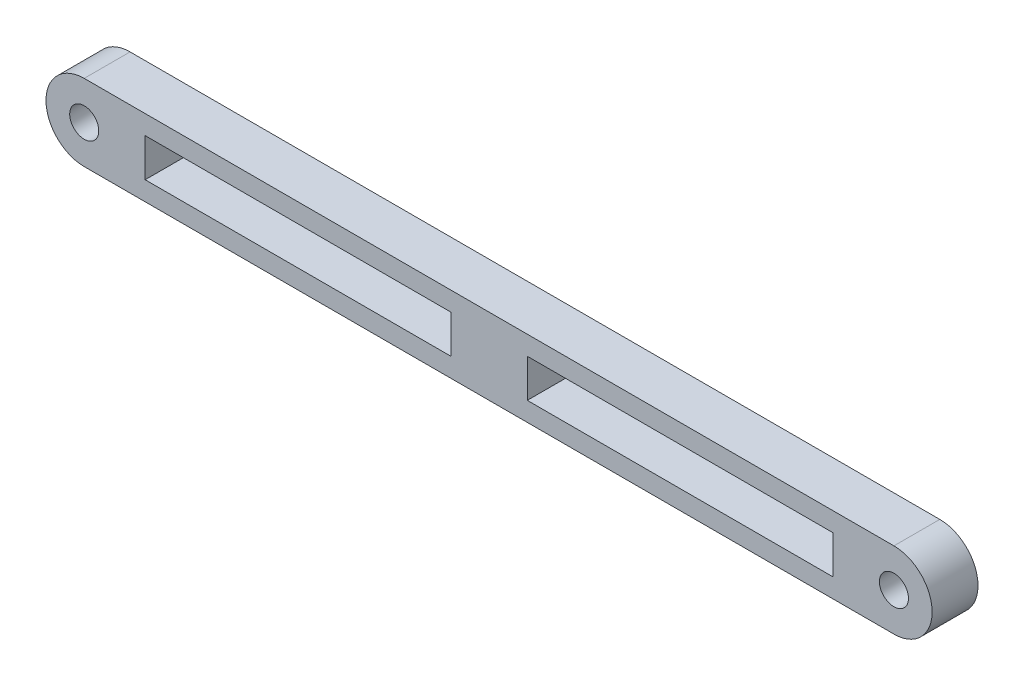
ISO-10303-21;
HEADER;
FILE_DESCRIPTION(('STEP AP214'),'2;1');
FILE_NAME('part.step','',(''),(''),'','','');
FILE_SCHEMA(('AUTOMOTIVE_DESIGN { 1 0 10303 214 1 1 1 1 }'));
ENDSEC;
DATA;
#1=APPLICATION_CONTEXT('core data for automotive mechanical design processes');
#2=APPLICATION_PROTOCOL_DEFINITION('international standard','automotive_design',2000,#1);
#3=PRODUCT_CONTEXT('',#1,'mechanical');
#4=PRODUCT('Part','Part','',(#3));
#5=PRODUCT_RELATED_PRODUCT_CATEGORY('part','',(#4));
#6=PRODUCT_DEFINITION_FORMATION('','',#4);
#7=PRODUCT_DEFINITION_CONTEXT('part definition',#1,'design');
#8=PRODUCT_DEFINITION('design','',#6,#7);
#9=PRODUCT_DEFINITION_SHAPE('','',#8);
#10=(LENGTH_UNIT() NAMED_UNIT(*) SI_UNIT(.MILLI.,.METRE.));
#11=(NAMED_UNIT(*) PLANE_ANGLE_UNIT() SI_UNIT($,.RADIAN.));
#12=(NAMED_UNIT(*) SI_UNIT($,.STERADIAN.) SOLID_ANGLE_UNIT());
#13=UNCERTAINTY_MEASURE_WITH_UNIT(LENGTH_MEASURE(1.E-05),#10,'distance_accuracy_value','');
#14=(GEOMETRIC_REPRESENTATION_CONTEXT(3) GLOBAL_UNCERTAINTY_ASSIGNED_CONTEXT((#13)) GLOBAL_UNIT_ASSIGNED_CONTEXT((#10,
#11,#12)) REPRESENTATION_CONTEXT('',''));
#15=CARTESIAN_POINT('',(0.,0.,0.));
#16=DIRECTION('',(0.,0.,1.));
#17=DIRECTION('',(1.,0.,0.));
#18=AXIS2_PLACEMENT_3D('',#15,#16,#17);
#19=CARTESIAN_POINT('',(52.97405025,0.,6.));
#20=DIRECTION('',(0.,0.,-1.));
#21=DIRECTION('',(-1.,0.,0.));
#22=AXIS2_PLACEMENT_3D('',#19,#20,#21);
#23=PLANE('',#22);
#24=DIRECTION('',(-1.,0.,0.));
#25=VECTOR('',#24,1.);
#26=CARTESIAN_POINT('',(-45.,2.5,6.));
#27=LINE('',#26,#25);
#28=CARTESIAN_POINT('',(-5.,2.5,6.));
#29=VERTEX_POINT('',#28);
#30=CARTESIAN_POINT('',(-45.,2.5,6.));
#31=VERTEX_POINT('',#30);
#32=EDGE_CURVE('E170',#29,#31,#27,.T.);
#33=ORIENTED_EDGE('',*,*,#32,.F.);
#34=DIRECTION('',(0.,1.,0.));
#35=VECTOR('',#34,1.);
#36=CARTESIAN_POINT('',(-5.,-2.5,6.));
#37=LINE('',#36,#35);
#38=CARTESIAN_POINT('',(-5.,-2.5,6.));
#39=VERTEX_POINT('',#38);
#40=EDGE_CURVE('E59',#39,#29,#37,.T.);
#41=ORIENTED_EDGE('',*,*,#40,.F.);
#42=DIRECTION('',(1.,0.,0.));
#43=VECTOR('',#42,1.);
#44=CARTESIAN_POINT('',(-45.,-2.5,6.));
#45=LINE('',#44,#43);
#46=CARTESIAN_POINT('',(-45.,-2.5,6.));
#47=VERTEX_POINT('',#46);
#48=EDGE_CURVE('E157',#47,#39,#45,.T.);
#49=ORIENTED_EDGE('',*,*,#48,.F.);
#50=DIRECTION('',(0.,-1.,0.));
#51=VECTOR('',#50,1.);
#52=CARTESIAN_POINT('',(-45.,-2.5,6.));
#53=LINE('',#52,#51);
#54=EDGE_CURVE('E161',#31,#47,#53,.T.);
#55=ORIENTED_EDGE('',*,*,#54,.F.);
#56=EDGE_LOOP('',(#33,#41,#49,#55));
#57=FACE_BOUND('',#56,.T.);
#58=DIRECTION('',(-1.,0.,0.));
#59=VECTOR('',#58,1.);
#60=CARTESIAN_POINT('',(4.99999999999999,2.50000000000002,6.));
#61=LINE('',#60,#59);
#62=CARTESIAN_POINT('',(45.,2.50000000000002,6.));
#63=VERTEX_POINT('',#62);
#64=CARTESIAN_POINT('',(4.99999999999999,2.50000000000002,6.));
#65=VERTEX_POINT('',#64);
#66=EDGE_CURVE('E207',#63,#65,#61,.T.);
#67=ORIENTED_EDGE('',*,*,#66,.F.);
#68=DIRECTION('',(0.,1.,0.));
#69=VECTOR('',#68,1.);
#70=CARTESIAN_POINT('',(45.,-2.49999999999998,6.));
#71=LINE('',#70,#69);
#72=CARTESIAN_POINT('',(45.,-2.49999999999998,6.));
#73=VERTEX_POINT('',#72);
#74=EDGE_CURVE('E67',#73,#63,#71,.T.);
#75=ORIENTED_EDGE('',*,*,#74,.F.);
#76=DIRECTION('',(1.,0.,0.));
#77=VECTOR('',#76,1.);
#78=CARTESIAN_POINT('',(5.,-2.49999999999998,6.));
#79=LINE('',#78,#77);
#80=CARTESIAN_POINT('',(5.,-2.49999999999998,6.));
#81=VERTEX_POINT('',#80);
#82=EDGE_CURVE('E198',#81,#73,#79,.T.);
#83=ORIENTED_EDGE('',*,*,#82,.F.);
#84=DIRECTION('',(0.,-1.,0.));
#85=VECTOR('',#84,1.);
#86=CARTESIAN_POINT('',(5.,-2.49999999999998,6.));
#87=LINE('',#86,#85);
#88=EDGE_CURVE('E202',#65,#81,#87,.T.);
#89=ORIENTED_EDGE('',*,*,#88,.F.);
#90=EDGE_LOOP('',(#67,#75,#83,#89));
#91=FACE_BOUND('',#90,.T.);
#92=CARTESIAN_POINT('',(52.97405025,0.,6.));
#93=DIRECTION('',(0.,0.,1.));
#94=DIRECTION('',(-1.,0.,0.));
#95=AXIS2_PLACEMENT_3D('',#92,#93,#94);
#96=CIRCLE('',#95,5.00000000000002);
#97=CARTESIAN_POINT('',(52.97405025,-5.00000000000002,6.));
#98=VERTEX_POINT('',#97);
#99=CARTESIAN_POINT('',(52.97405025,5.00000000000002,6.));
#100=VERTEX_POINT('',#99);
#101=EDGE_CURVE('E243',#98,#100,#96,.T.);
#102=ORIENTED_EDGE('',*,*,#101,.T.);
#103=DIRECTION('',(-1.,0.,0.));
#104=VECTOR('',#103,1.);
#105=CARTESIAN_POINT('',(-52.97405025,5.,6.));
#106=LINE('',#105,#104);
#107=CARTESIAN_POINT('',(-52.97405025,5.00000000000001,6.));
#108=VERTEX_POINT('',#107);
#109=EDGE_CURVE('E247',#100,#108,#106,.T.);
#110=ORIENTED_EDGE('',*,*,#109,.T.);
#111=CARTESIAN_POINT('',(-52.97405025,0.,6.));
#112=DIRECTION('',(0.,0.,1.));
#113=DIRECTION('',(1.,0.,0.));
#114=AXIS2_PLACEMENT_3D('',#111,#112,#113);
#115=CIRCLE('',#114,5.00000000000002);
#116=CARTESIAN_POINT('',(-52.97405025,-5.00000000000004,6.));
#117=VERTEX_POINT('',#116);
#118=EDGE_CURVE('E251',#108,#117,#115,.T.);
#119=ORIENTED_EDGE('',*,*,#118,.T.);
#120=DIRECTION('',(1.,0.,0.));
#121=VECTOR('',#120,1.);
#122=CARTESIAN_POINT('',(-52.97405025,-5.00000000000004,6.));
#123=LINE('',#122,#121);
#124=EDGE_CURVE('E254',#117,#98,#123,.T.);
#125=ORIENTED_EDGE('',*,*,#124,.T.);
#126=EDGE_LOOP('',(#102,#110,#119,#125));
#127=FACE_BOUND('',#126,.T.);
#128=CARTESIAN_POINT('',(-52.97405025,0.,6.));
#129=DIRECTION('',(0.,0.,1.));
#130=DIRECTION('',(1.,0.,0.));
#131=AXIS2_PLACEMENT_3D('',#128,#129,#130);
#132=CIRCLE('',#131,1.9);
#133=CARTESIAN_POINT('',(-51.07405025,0.,6.));
#134=VERTEX_POINT('',#133);
#135=EDGE_CURVE('E235',#134,#134,#132,.T.);
#136=ORIENTED_EDGE('',*,*,#135,.F.);
#137=EDGE_LOOP('',(#136));
#138=FACE_BOUND('',#137,.T.);
#139=CARTESIAN_POINT('',(52.97405025,0.,6.));
#140=DIRECTION('',(0.,0.,1.));
#141=DIRECTION('',(1.,0.,0.));
#142=AXIS2_PLACEMENT_3D('',#139,#140,#141);
#143=CIRCLE('',#142,1.9);
#144=CARTESIAN_POINT('',(54.87405025,0.,6.));
#145=VERTEX_POINT('',#144);
#146=EDGE_CURVE('E227',#145,#145,#143,.T.);
#147=ORIENTED_EDGE('',*,*,#146,.F.);
#148=EDGE_LOOP('',(#147));
#149=FACE_BOUND('',#148,.T.);
#150=ADVANCED_FACE('F43',(#57,#91,#127,#138,#149),#23,.F.);
#151=CARTESIAN_POINT('',(52.97405025,0.,0.));
#152=DIRECTION('',(0.,0.,-1.));
#153=DIRECTION('',(-1.,0.,0.));
#154=AXIS2_PLACEMENT_3D('',#151,#152,#153);
#155=PLANE('',#154);
#156=DIRECTION('',(0.,1.,0.));
#157=VECTOR('',#156,1.);
#158=CARTESIAN_POINT('',(-5.,-2.5,0.));
#159=LINE('',#158,#157);
#160=CARTESIAN_POINT('',(-5.,-2.5,0.));
#161=VERTEX_POINT('',#160);
#162=CARTESIAN_POINT('',(-5.,2.5,0.));
#163=VERTEX_POINT('',#162);
#164=EDGE_CURVE('E135',#161,#163,#159,.T.);
#165=ORIENTED_EDGE('',*,*,#164,.T.);
#166=DIRECTION('',(-1.,0.,0.));
#167=VECTOR('',#166,1.);
#168=CARTESIAN_POINT('',(-45.,2.5,0.));
#169=LINE('',#168,#167);
#170=CARTESIAN_POINT('',(-45.,2.5,0.));
#171=VERTEX_POINT('',#170);
#172=EDGE_CURVE('E146',#163,#171,#169,.T.);
#173=ORIENTED_EDGE('',*,*,#172,.T.);
#174=DIRECTION('',(0.,-1.,0.));
#175=VECTOR('',#174,1.);
#176=CARTESIAN_POINT('',(-45.,-2.5,0.));
#177=LINE('',#176,#175);
#178=CARTESIAN_POINT('',(-45.,-2.5,0.));
#179=VERTEX_POINT('',#178);
#180=EDGE_CURVE('E151',#171,#179,#177,.T.);
#181=ORIENTED_EDGE('',*,*,#180,.T.);
#182=DIRECTION('',(1.,0.,0.));
#183=VECTOR('',#182,1.);
#184=CARTESIAN_POINT('',(-45.,-2.5,0.));
#185=LINE('',#184,#183);
#186=EDGE_CURVE('E142',#179,#161,#185,.T.);
#187=ORIENTED_EDGE('',*,*,#186,.T.);
#188=EDGE_LOOP('',(#165,#173,#181,#187));
#189=FACE_BOUND('',#188,.T.);
#190=DIRECTION('',(0.,1.,0.));
#191=VECTOR('',#190,1.);
#192=CARTESIAN_POINT('',(45.,-2.49999999999998,0.));
#193=LINE('',#192,#191);
#194=CARTESIAN_POINT('',(45.,-2.49999999999998,0.));
#195=VERTEX_POINT('',#194);
#196=CARTESIAN_POINT('',(45.,2.50000000000002,0.));
#197=VERTEX_POINT('',#196);
#198=EDGE_CURVE('E203',#195,#197,#193,.T.);
#199=ORIENTED_EDGE('',*,*,#198,.T.);
#200=DIRECTION('',(-1.,0.,0.));
#201=VECTOR('',#200,1.);
#202=CARTESIAN_POINT('',(4.99999999999999,2.50000000000002,0.));
#203=LINE('',#202,#201);
#204=CARTESIAN_POINT('',(5.,2.50000000000002,0.));
#205=VERTEX_POINT('',#204);
#206=EDGE_CURVE('E220',#197,#205,#203,.T.);
#207=ORIENTED_EDGE('',*,*,#206,.T.);
#208=DIRECTION('',(0.,-1.,0.));
#209=VECTOR('',#208,1.);
#210=CARTESIAN_POINT('',(5.,-2.49999999999998,0.));
#211=LINE('',#210,#209);
#212=CARTESIAN_POINT('',(5.,-2.49999999999998,0.));
#213=VERTEX_POINT('',#212);
#214=EDGE_CURVE('E216',#205,#213,#211,.T.);
#215=ORIENTED_EDGE('',*,*,#214,.T.);
#216=DIRECTION('',(1.,0.,0.));
#217=VECTOR('',#216,1.);
#218=CARTESIAN_POINT('',(5.,-2.49999999999998,0.));
#219=LINE('',#218,#217);
#220=EDGE_CURVE('E188',#213,#195,#219,.T.);
#221=ORIENTED_EDGE('',*,*,#220,.T.);
#222=EDGE_LOOP('',(#199,#207,#215,#221));
#223=FACE_BOUND('',#222,.T.);
#224=CARTESIAN_POINT('',(-52.97405025,0.,0.));
#225=DIRECTION('',(0.,0.,1.));
#226=DIRECTION('',(1.,0.,0.));
#227=AXIS2_PLACEMENT_3D('',#224,#225,#226);
#228=CIRCLE('',#227,1.9);
#229=CARTESIAN_POINT('',(-51.07405025,0.,0.));
#230=VERTEX_POINT('',#229);
#231=EDGE_CURVE('E231',#230,#230,#228,.T.);
#232=ORIENTED_EDGE('',*,*,#231,.T.);
#233=EDGE_LOOP('',(#232));
#234=FACE_BOUND('',#233,.T.);
#235=CARTESIAN_POINT('',(52.97405025,0.,0.));
#236=DIRECTION('',(0.,0.,1.));
#237=DIRECTION('',(-1.,0.,0.));
#238=AXIS2_PLACEMENT_3D('',#235,#236,#237);
#239=CIRCLE('',#238,5.00000000000002);
#240=CARTESIAN_POINT('',(52.97405025,-5.00000000000002,0.));
#241=VERTEX_POINT('',#240);
#242=CARTESIAN_POINT('',(52.97405025,5.00000000000002,0.));
#243=VERTEX_POINT('',#242);
#244=EDGE_CURVE('E239',#241,#243,#239,.T.);
#245=ORIENTED_EDGE('',*,*,#244,.F.);
#246=DIRECTION('',(1.,0.,0.));
#247=VECTOR('',#246,1.);
#248=CARTESIAN_POINT('',(-52.97405025,-5.00000000000004,0.));
#249=LINE('',#248,#247);
#250=CARTESIAN_POINT('',(-52.97405025,-5.00000000000004,0.));
#251=VERTEX_POINT('',#250);
#252=EDGE_CURVE('E248',#251,#241,#249,.T.);
#253=ORIENTED_EDGE('',*,*,#252,.F.);
#254=CARTESIAN_POINT('',(-52.97405025,0.,0.));
#255=DIRECTION('',(0.,0.,1.));
#256=DIRECTION('',(1.,0.,0.));
#257=AXIS2_PLACEMENT_3D('',#254,#255,#256);
#258=CIRCLE('',#257,5.00000000000002);
#259=CARTESIAN_POINT('',(-52.97405025,5.00000000000001,0.));
#260=VERTEX_POINT('',#259);
#261=EDGE_CURVE('E264',#260,#251,#258,.T.);
#262=ORIENTED_EDGE('',*,*,#261,.F.);
#263=DIRECTION('',(-1.,0.,0.));
#264=VECTOR('',#263,1.);
#265=CARTESIAN_POINT('',(-52.97405025,5.,0.));
#266=LINE('',#265,#264);
#267=EDGE_CURVE('E261',#243,#260,#266,.T.);
#268=ORIENTED_EDGE('',*,*,#267,.F.);
#269=EDGE_LOOP('',(#245,#253,#262,#268));
#270=FACE_BOUND('',#269,.T.);
#271=CARTESIAN_POINT('',(52.97405025,0.,0.));
#272=DIRECTION('',(0.,0.,1.));
#273=DIRECTION('',(1.,0.,0.));
#274=AXIS2_PLACEMENT_3D('',#271,#272,#273);
#275=CIRCLE('',#274,1.9);
#276=CARTESIAN_POINT('',(54.87405025,0.,0.));
#277=VERTEX_POINT('',#276);
#278=EDGE_CURVE('E179',#277,#277,#275,.T.);
#279=ORIENTED_EDGE('',*,*,#278,.T.);
#280=EDGE_LOOP('',(#279));
#281=FACE_BOUND('',#280,.T.);
#282=ADVANCED_FACE('F153',(#189,#223,#234,#270,#281),#155,.T.);
#283=CARTESIAN_POINT('',(52.97405025,0.,6.));
#284=DIRECTION('',(0.,0.,-1.));
#285=DIRECTION('',(-1.,0.,0.));
#286=AXIS2_PLACEMENT_3D('',#283,#284,#285);
#287=CYLINDRICAL_SURFACE('',#286,5.00000000000002);
#288=ORIENTED_EDGE('',*,*,#244,.T.);
#289=DIRECTION('',(0.,0.,-1.));
#290=VECTOR('',#289,1.);
#291=CARTESIAN_POINT('',(52.97405025,5.00000000000002,6.));
#292=LINE('',#291,#290);
#293=EDGE_CURVE('E11',#100,#243,#292,.T.);
#294=ORIENTED_EDGE('',*,*,#293,.F.);
#295=ORIENTED_EDGE('',*,*,#101,.F.);
#296=DIRECTION('',(0.,0.,-1.));
#297=VECTOR('',#296,1.);
#298=CARTESIAN_POINT('',(52.97405025,-5.00000000000002,6.));
#299=LINE('',#298,#297);
#300=EDGE_CURVE('E257',#98,#241,#299,.T.);
#301=ORIENTED_EDGE('',*,*,#300,.T.);
#302=EDGE_LOOP('',(#288,#294,#295,#301));
#303=FACE_BOUND('',#302,.T.);
#304=ADVANCED_FACE('F45',(#303),#287,.T.);
#305=CARTESIAN_POINT('',(-52.97405025,5.,6.));
#306=DIRECTION('',(0.,-1.,0.));
#307=DIRECTION('',(1.,0.,0.));
#308=AXIS2_PLACEMENT_3D('',#305,#306,#307);
#309=PLANE('',#308);
#310=ORIENTED_EDGE('',*,*,#267,.T.);
#311=DIRECTION('',(0.,0.,-1.));
#312=VECTOR('',#311,1.);
#313=CARTESIAN_POINT('',(-52.97405025,5.00000000000001,6.));
#314=LINE('',#313,#312);
#315=EDGE_CURVE('E52',#108,#260,#314,.T.);
#316=ORIENTED_EDGE('',*,*,#315,.F.);
#317=ORIENTED_EDGE('',*,*,#109,.F.);
#318=ORIENTED_EDGE('',*,*,#293,.T.);
#319=EDGE_LOOP('',(#310,#316,#317,#318));
#320=FACE_BOUND('',#319,.T.);
#321=ADVANCED_FACE('F297',(#320),#309,.F.);
#322=CARTESIAN_POINT('',(-52.97405025,0.,6.));
#323=DIRECTION('',(0.,0.,-1.));
#324=DIRECTION('',(-1.,0.,0.));
#325=AXIS2_PLACEMENT_3D('',#322,#323,#324);
#326=CYLINDRICAL_SURFACE('',#325,5.00000000000002);
#327=ORIENTED_EDGE('',*,*,#261,.T.);
#328=DIRECTION('',(0.,0.,-1.));
#329=VECTOR('',#328,1.);
#330=CARTESIAN_POINT('',(-52.97405025,-5.00000000000004,6.));
#331=LINE('',#330,#329);
#332=EDGE_CURVE('E272',#117,#251,#331,.T.);
#333=ORIENTED_EDGE('',*,*,#332,.F.);
#334=ORIENTED_EDGE('',*,*,#118,.F.);
#335=ORIENTED_EDGE('',*,*,#315,.T.);
#336=EDGE_LOOP('',(#327,#333,#334,#335));
#337=FACE_BOUND('',#336,.T.);
#338=ADVANCED_FACE('F281',(#337),#326,.T.);
#339=CARTESIAN_POINT('',(-52.97405025,-5.00000000000004,6.));
#340=DIRECTION('',(0.,1.,0.));
#341=DIRECTION('',(-1.,0.,0.));
#342=AXIS2_PLACEMENT_3D('',#339,#340,#341);
#343=PLANE('',#342);
#344=ORIENTED_EDGE('',*,*,#252,.T.);
#345=ORIENTED_EDGE('',*,*,#300,.F.);
#346=ORIENTED_EDGE('',*,*,#124,.F.);
#347=ORIENTED_EDGE('',*,*,#332,.T.);
#348=EDGE_LOOP('',(#344,#345,#346,#347));
#349=FACE_BOUND('',#348,.T.);
#350=ADVANCED_FACE('F290',(#349),#343,.F.);
#351=CARTESIAN_POINT('',(-52.97405025,0.,6.));
#352=DIRECTION('',(0.,0.,-1.));
#353=DIRECTION('',(-1.,0.,0.));
#354=AXIS2_PLACEMENT_3D('',#351,#352,#353);
#355=CYLINDRICAL_SURFACE('',#354,1.9);
#356=ORIENTED_EDGE('',*,*,#135,.T.);
#357=EDGE_LOOP('',(#356));
#358=FACE_BOUND('',#357,.T.);
#359=ORIENTED_EDGE('',*,*,#231,.F.);
#360=EDGE_LOOP('',(#359));
#361=FACE_BOUND('',#360,.T.);
#362=ADVANCED_FACE('F313',(#358,#361),#355,.F.);
#363=CARTESIAN_POINT('',(52.97405025,0.,6.));
#364=DIRECTION('',(0.,0.,-1.));
#365=DIRECTION('',(-1.,0.,0.));
#366=AXIS2_PLACEMENT_3D('',#363,#364,#365);
#367=CYLINDRICAL_SURFACE('',#366,1.9);
#368=ORIENTED_EDGE('',*,*,#146,.T.);
#369=EDGE_LOOP('',(#368));
#370=FACE_BOUND('',#369,.T.);
#371=ORIENTED_EDGE('',*,*,#278,.F.);
#372=EDGE_LOOP('',(#371));
#373=FACE_BOUND('',#372,.T.);
#374=ADVANCED_FACE('F320',(#370,#373),#367,.F.);
#375=CARTESIAN_POINT('',(45.,-2.49999999999998,0.));
#376=DIRECTION('',(1.,0.,0.));
#377=DIRECTION('',(0.,0.,-1.));
#378=AXIS2_PLACEMENT_3D('',#375,#376,#377);
#379=PLANE('',#378);
#380=ORIENTED_EDGE('',*,*,#74,.T.);
#381=DIRECTION('',(0.,0.,1.));
#382=VECTOR('',#381,1.);
#383=CARTESIAN_POINT('',(45.,2.50000000000002,0.));
#384=LINE('',#383,#382);
#385=EDGE_CURVE('E185',#197,#63,#384,.T.);
#386=ORIENTED_EDGE('',*,*,#385,.F.);
#387=ORIENTED_EDGE('',*,*,#198,.F.);
#388=DIRECTION('',(0.,0.,1.));
#389=VECTOR('',#388,1.);
#390=CARTESIAN_POINT('',(45.,-2.49999999999998,0.));
#391=LINE('',#390,#389);
#392=EDGE_CURVE('E195',#195,#73,#391,.T.);
#393=ORIENTED_EDGE('',*,*,#392,.T.);
#394=EDGE_LOOP('',(#380,#386,#387,#393));
#395=FACE_BOUND('',#394,.T.);
#396=ADVANCED_FACE('F325',(#395),#379,.F.);
#397=CARTESIAN_POINT('',(5.,-2.49999999999998,0.));
#398=DIRECTION('',(0.,-1.,0.));
#399=DIRECTION('',(0.,0.,-1.));
#400=AXIS2_PLACEMENT_3D('',#397,#398,#399);
#401=PLANE('',#400);
#402=ORIENTED_EDGE('',*,*,#82,.T.);
#403=ORIENTED_EDGE('',*,*,#392,.F.);
#404=ORIENTED_EDGE('',*,*,#220,.F.);
#405=DIRECTION('',(0.,0.,1.));
#406=VECTOR('',#405,1.);
#407=CARTESIAN_POINT('',(5.,-2.49999999999998,0.));
#408=LINE('',#407,#406);
#409=EDGE_CURVE('E192',#213,#81,#408,.T.);
#410=ORIENTED_EDGE('',*,*,#409,.T.);
#411=EDGE_LOOP('',(#402,#403,#404,#410));
#412=FACE_BOUND('',#411,.T.);
#413=ADVANCED_FACE('F338',(#412),#401,.F.);
#414=CARTESIAN_POINT('',(5.,-2.49999999999998,0.));
#415=DIRECTION('',(-1.,0.,0.));
#416=DIRECTION('',(0.,-1.,0.));
#417=AXIS2_PLACEMENT_3D('',#414,#415,#416);
#418=PLANE('',#417);
#419=ORIENTED_EDGE('',*,*,#88,.T.);
#420=ORIENTED_EDGE('',*,*,#409,.F.);
#421=ORIENTED_EDGE('',*,*,#214,.F.);
#422=DIRECTION('',(0.,0.,1.));
#423=VECTOR('',#422,1.);
#424=CARTESIAN_POINT('',(4.99999999999999,2.50000000000002,0.));
#425=LINE('',#424,#423);
#426=EDGE_CURVE('E189',#205,#65,#425,.T.);
#427=ORIENTED_EDGE('',*,*,#426,.T.);
#428=EDGE_LOOP('',(#419,#420,#421,#427));
#429=FACE_BOUND('',#428,.T.);
#430=ADVANCED_FACE('F343',(#429),#418,.F.);
#431=CARTESIAN_POINT('',(4.99999999999999,2.50000000000002,0.));
#432=DIRECTION('',(0.,1.,0.));
#433=DIRECTION('',(0.,0.,1.));
#434=AXIS2_PLACEMENT_3D('',#431,#432,#433);
#435=PLANE('',#434);
#436=ORIENTED_EDGE('',*,*,#66,.T.);
#437=ORIENTED_EDGE('',*,*,#426,.F.);
#438=ORIENTED_EDGE('',*,*,#206,.F.);
#439=ORIENTED_EDGE('',*,*,#385,.T.);
#440=EDGE_LOOP('',(#436,#437,#438,#439));
#441=FACE_BOUND('',#440,.T.);
#442=ADVANCED_FACE('F347',(#441),#435,.F.);
#443=CARTESIAN_POINT('',(-5.,-2.5,0.));
#444=DIRECTION('',(1.,0.,0.));
#445=DIRECTION('',(0.,0.,-1.));
#446=AXIS2_PLACEMENT_3D('',#443,#444,#445);
#447=PLANE('',#446);
#448=ORIENTED_EDGE('',*,*,#40,.T.);
#449=DIRECTION('',(0.,0.,1.));
#450=VECTOR('',#449,1.);
#451=CARTESIAN_POINT('',(-5.,2.5,0.));
#452=LINE('',#451,#450);
#453=EDGE_CURVE('E131',#163,#29,#452,.T.);
#454=ORIENTED_EDGE('',*,*,#453,.F.);
#455=ORIENTED_EDGE('',*,*,#164,.F.);
#456=DIRECTION('',(0.,0.,1.));
#457=VECTOR('',#456,1.);
#458=CARTESIAN_POINT('',(-5.,-2.5,0.));
#459=LINE('',#458,#457);
#460=EDGE_CURVE('E176',#161,#39,#459,.T.);
#461=ORIENTED_EDGE('',*,*,#460,.T.);
#462=EDGE_LOOP('',(#448,#454,#455,#461));
#463=FACE_BOUND('',#462,.T.);
#464=ADVANCED_FACE('F133',(#463),#447,.F.);
#465=CARTESIAN_POINT('',(-45.,-2.5,0.));
#466=DIRECTION('',(0.,-1.,0.));
#467=DIRECTION('',(0.,0.,-1.));
#468=AXIS2_PLACEMENT_3D('',#465,#466,#467);
#469=PLANE('',#468);
#470=ORIENTED_EDGE('',*,*,#48,.T.);
#471=ORIENTED_EDGE('',*,*,#460,.F.);
#472=ORIENTED_EDGE('',*,*,#186,.F.);
#473=DIRECTION('',(0.,0.,1.));
#474=VECTOR('',#473,1.);
#475=CARTESIAN_POINT('',(-45.,-2.5,0.));
#476=LINE('',#475,#474);
#477=EDGE_CURVE('E180',#179,#47,#476,.T.);
#478=ORIENTED_EDGE('',*,*,#477,.T.);
#479=EDGE_LOOP('',(#470,#471,#472,#478));
#480=FACE_BOUND('',#479,.T.);
#481=ADVANCED_FACE('F354',(#480),#469,.F.);
#482=CARTESIAN_POINT('',(-45.,-2.5,0.));
#483=DIRECTION('',(-1.,0.,0.));
#484=DIRECTION('',(0.,0.,1.));
#485=AXIS2_PLACEMENT_3D('',#482,#483,#484);
#486=PLANE('',#485);
#487=ORIENTED_EDGE('',*,*,#54,.T.);
#488=ORIENTED_EDGE('',*,*,#477,.F.);
#489=ORIENTED_EDGE('',*,*,#180,.F.);
#490=DIRECTION('',(0.,0.,1.));
#491=VECTOR('',#490,1.);
#492=CARTESIAN_POINT('',(-45.,2.5,0.));
#493=LINE('',#492,#491);
#494=EDGE_CURVE('E141',#171,#31,#493,.T.);
#495=ORIENTED_EDGE('',*,*,#494,.T.);
#496=EDGE_LOOP('',(#487,#488,#489,#495));
#497=FACE_BOUND('',#496,.T.);
#498=ADVANCED_FACE('F357',(#497),#486,.F.);
#499=CARTESIAN_POINT('',(-45.,2.5,0.));
#500=DIRECTION('',(0.,1.,0.));
#501=DIRECTION('',(-1.,0.,0.));
#502=AXIS2_PLACEMENT_3D('',#499,#500,#501);
#503=PLANE('',#502);
#504=ORIENTED_EDGE('',*,*,#32,.T.);
#505=ORIENTED_EDGE('',*,*,#494,.F.);
#506=ORIENTED_EDGE('',*,*,#172,.F.);
#507=ORIENTED_EDGE('',*,*,#453,.T.);
#508=EDGE_LOOP('',(#504,#505,#506,#507));
#509=FACE_BOUND('',#508,.T.);
#510=ADVANCED_FACE('F147',(#509),#503,.F.);
#511=CLOSED_SHELL('',(#150,#282,#304,#321,#338,#350,#362,#374,#396,#413,#430,#442,#464,#481,
#498,#510));
#512=MANIFOLD_SOLID_BREP('B2',#511);
#513=ADVANCED_BREP_SHAPE_REPRESENTATION('',(#18,#512),#14);
#514=SHAPE_DEFINITION_REPRESENTATION(#9,#513);
ENDSEC;
END-ISO-10303-21;
